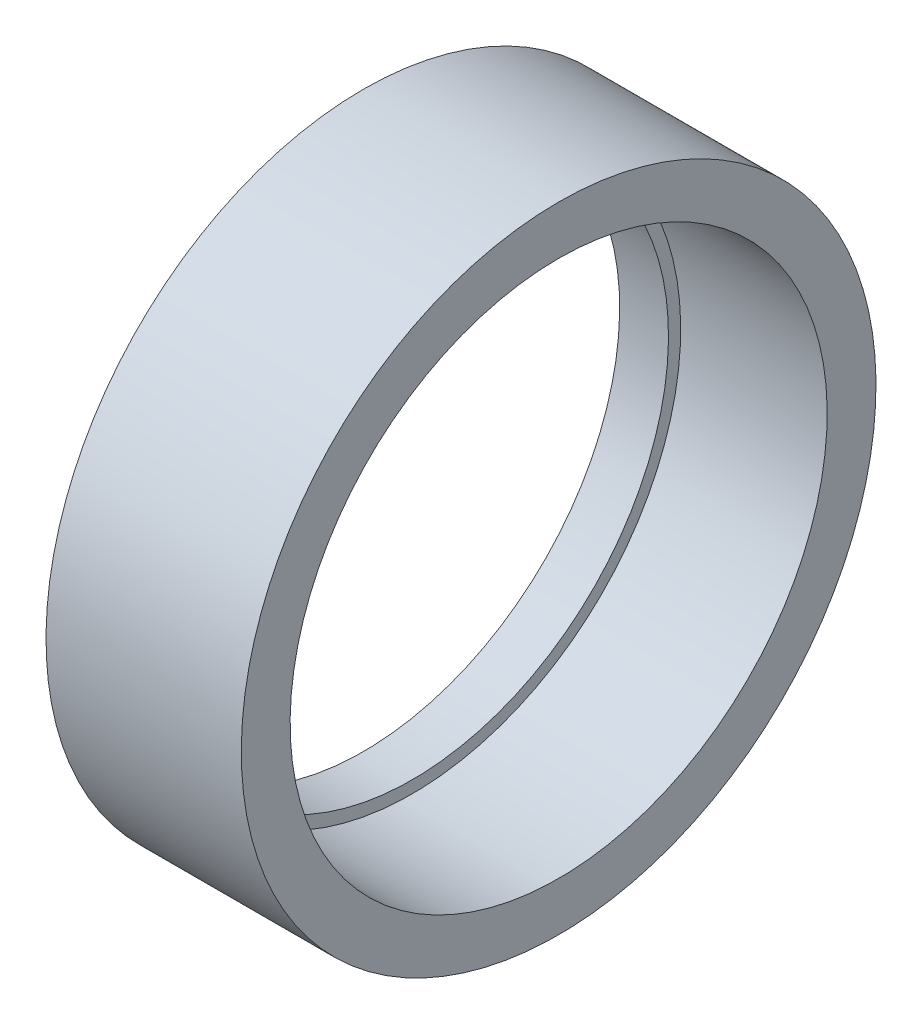
ISO-10303-21;
HEADER;
FILE_DESCRIPTION(('STEP AP214'),'2;1');
FILE_NAME('part.step','',(''),(''),'','','');
FILE_SCHEMA(('AUTOMOTIVE_DESIGN { 1 0 10303 214 1 1 1 1 }'));
ENDSEC;
DATA;
#1=APPLICATION_CONTEXT('core data for automotive mechanical design processes');
#2=APPLICATION_PROTOCOL_DEFINITION('international standard','automotive_design',2000,#1);
#3=PRODUCT_CONTEXT('',#1,'mechanical');
#4=PRODUCT('Part','Part','',(#3));
#5=PRODUCT_RELATED_PRODUCT_CATEGORY('part','',(#4));
#6=PRODUCT_DEFINITION_FORMATION('','',#4);
#7=PRODUCT_DEFINITION_CONTEXT('part definition',#1,'design');
#8=PRODUCT_DEFINITION('design','',#6,#7);
#9=PRODUCT_DEFINITION_SHAPE('','',#8);
#10=(LENGTH_UNIT() NAMED_UNIT(*) SI_UNIT(.MILLI.,.METRE.));
#11=(NAMED_UNIT(*) PLANE_ANGLE_UNIT() SI_UNIT($,.RADIAN.));
#12=(NAMED_UNIT(*) SI_UNIT($,.STERADIAN.) SOLID_ANGLE_UNIT());
#13=UNCERTAINTY_MEASURE_WITH_UNIT(LENGTH_MEASURE(1.E-05),#10,'distance_accuracy_value','');
#14=(GEOMETRIC_REPRESENTATION_CONTEXT(3) GLOBAL_UNCERTAINTY_ASSIGNED_CONTEXT((#13)) GLOBAL_UNIT_ASSIGNED_CONTEXT((#10,
#11,#12)) REPRESENTATION_CONTEXT('',''));
#15=CARTESIAN_POINT('',(0.,0.,0.));
#16=DIRECTION('',(0.,0.,1.));
#17=DIRECTION('',(1.,0.,0.));
#18=AXIS2_PLACEMENT_3D('',#15,#16,#17);
#19=CARTESIAN_POINT('',(0.,0.,0.));
#20=DIRECTION('',(1.,0.,0.));
#21=DIRECTION('',(0.,1.,0.));
#22=AXIS2_PLACEMENT_3D('',#19,#20,#21);
#23=CYLINDRICAL_SURFACE('',#22,11.);
#24=CARTESIAN_POINT('',(0.,0.,0.));
#25=DIRECTION('',(1.,0.,0.));
#26=DIRECTION('',(0.,1.,0.));
#27=AXIS2_PLACEMENT_3D('',#24,#25,#26);
#28=CIRCLE('',#27,11.);
#29=CARTESIAN_POINT('',(0.,11.,0.));
#30=VERTEX_POINT('',#29);
#31=EDGE_CURVE('E10',#30,#30,#28,.T.);
#32=ORIENTED_EDGE('',*,*,#31,.T.);
#33=EDGE_LOOP('',(#32));
#34=FACE_BOUND('',#33,.T.);
#35=CARTESIAN_POINT('',(-6.,0.,0.));
#36=DIRECTION('',(1.,0.,0.));
#37=DIRECTION('',(0.,1.,0.));
#38=AXIS2_PLACEMENT_3D('',#35,#36,#37);
#39=CIRCLE('',#38,11.);
#40=CARTESIAN_POINT('',(-6.,11.,0.));
#41=VERTEX_POINT('',#40);
#42=EDGE_CURVE('E66',#41,#41,#39,.T.);
#43=ORIENTED_EDGE('',*,*,#42,.F.);
#44=EDGE_LOOP('',(#43));
#45=FACE_BOUND('',#44,.T.);
#46=ADVANCED_FACE('F39',(#34,#45),#23,.F.);
#47=CARTESIAN_POINT('',(0.,11.,0.));
#48=DIRECTION('',(1.,0.,0.));
#49=DIRECTION('',(0.,1.,0.));
#50=AXIS2_PLACEMENT_3D('',#47,#48,#49);
#51=PLANE('',#50);
#52=CARTESIAN_POINT('',(0.,0.,0.));
#53=DIRECTION('',(1.,0.,0.));
#54=DIRECTION('',(0.,1.,0.));
#55=AXIS2_PLACEMENT_3D('',#52,#53,#54);
#56=CIRCLE('',#55,13.);
#57=CARTESIAN_POINT('',(0.,13.,0.));
#58=VERTEX_POINT('',#57);
#59=EDGE_CURVE('E46',#58,#58,#56,.T.);
#60=ORIENTED_EDGE('',*,*,#59,.T.);
#61=EDGE_LOOP('',(#60));
#62=FACE_BOUND('',#61,.T.);
#63=ORIENTED_EDGE('',*,*,#31,.F.);
#64=EDGE_LOOP('',(#63));
#65=FACE_BOUND('',#64,.T.);
#66=ADVANCED_FACE('F75',(#62,#65),#51,.T.);
#67=CARTESIAN_POINT('',(0.,0.,0.));
#68=DIRECTION('',(1.,0.,0.));
#69=DIRECTION('',(0.,1.,0.));
#70=AXIS2_PLACEMENT_3D('',#67,#68,#69);
#71=CYLINDRICAL_SURFACE('',#70,13.);
#72=CARTESIAN_POINT('',(-8.,0.,0.));
#73=DIRECTION('',(1.,0.,0.));
#74=DIRECTION('',(0.,1.,0.));
#75=AXIS2_PLACEMENT_3D('',#72,#73,#74);
#76=CIRCLE('',#75,13.);
#77=CARTESIAN_POINT('',(-8.,13.,0.));
#78=VERTEX_POINT('',#77);
#79=EDGE_CURVE('E51',#78,#78,#76,.T.);
#80=ORIENTED_EDGE('',*,*,#79,.T.);
#81=EDGE_LOOP('',(#80));
#82=FACE_BOUND('',#81,.T.);
#83=ORIENTED_EDGE('',*,*,#59,.F.);
#84=EDGE_LOOP('',(#83));
#85=FACE_BOUND('',#84,.T.);
#86=ADVANCED_FACE('F79',(#82,#85),#71,.T.);
#87=CARTESIAN_POINT('',(-8.,13.,0.));
#88=DIRECTION('',(-1.,0.,0.));
#89=DIRECTION('',(0.,-1.,0.));
#90=AXIS2_PLACEMENT_3D('',#87,#88,#89);
#91=PLANE('',#90);
#92=CARTESIAN_POINT('',(-8.,0.,0.));
#93=DIRECTION('',(1.,0.,0.));
#94=DIRECTION('',(0.,1.,0.));
#95=AXIS2_PLACEMENT_3D('',#92,#93,#94);
#96=CIRCLE('',#95,10.5);
#97=CARTESIAN_POINT('',(-8.,10.5,0.));
#98=VERTEX_POINT('',#97);
#99=EDGE_CURVE('E56',#98,#98,#96,.T.);
#100=ORIENTED_EDGE('',*,*,#99,.T.);
#101=EDGE_LOOP('',(#100));
#102=FACE_BOUND('',#101,.T.);
#103=ORIENTED_EDGE('',*,*,#79,.F.);
#104=EDGE_LOOP('',(#103));
#105=FACE_BOUND('',#104,.T.);
#106=ADVANCED_FACE('F83',(#102,#105),#91,.T.);
#107=CARTESIAN_POINT('',(0.,0.,0.));
#108=DIRECTION('',(1.,0.,0.));
#109=DIRECTION('',(0.,1.,0.));
#110=AXIS2_PLACEMENT_3D('',#107,#108,#109);
#111=CYLINDRICAL_SURFACE('',#110,10.5);
#112=CARTESIAN_POINT('',(-6.,0.,0.));
#113=DIRECTION('',(1.,0.,0.));
#114=DIRECTION('',(0.,1.,0.));
#115=AXIS2_PLACEMENT_3D('',#112,#113,#114);
#116=CIRCLE('',#115,10.5);
#117=CARTESIAN_POINT('',(-6.,10.5,0.));
#118=VERTEX_POINT('',#117);
#119=EDGE_CURVE('E62',#118,#118,#116,.T.);
#120=ORIENTED_EDGE('',*,*,#119,.T.);
#121=EDGE_LOOP('',(#120));
#122=FACE_BOUND('',#121,.T.);
#123=ORIENTED_EDGE('',*,*,#99,.F.);
#124=EDGE_LOOP('',(#123));
#125=FACE_BOUND('',#124,.T.);
#126=ADVANCED_FACE('F90',(#122,#125),#111,.F.);
#127=CARTESIAN_POINT('',(-6.,11.,0.));
#128=DIRECTION('',(1.,0.,0.));
#129=DIRECTION('',(0.,1.,0.));
#130=AXIS2_PLACEMENT_3D('',#127,#128,#129);
#131=PLANE('',#130);
#132=ORIENTED_EDGE('',*,*,#42,.T.);
#133=EDGE_LOOP('',(#132));
#134=FACE_BOUND('',#133,.T.);
#135=ORIENTED_EDGE('',*,*,#119,.F.);
#136=EDGE_LOOP('',(#135));
#137=FACE_BOUND('',#136,.T.);
#138=ADVANCED_FACE('F71',(#134,#137),#131,.T.);
#139=CLOSED_SHELL('',(#46,#66,#86,#106,#126,#138));
#140=MANIFOLD_SOLID_BREP('B2',#139);
#141=ADVANCED_BREP_SHAPE_REPRESENTATION('',(#18,#140),#14);
#142=SHAPE_DEFINITION_REPRESENTATION(#9,#141);
ENDSEC;
END-ISO-10303-21;
